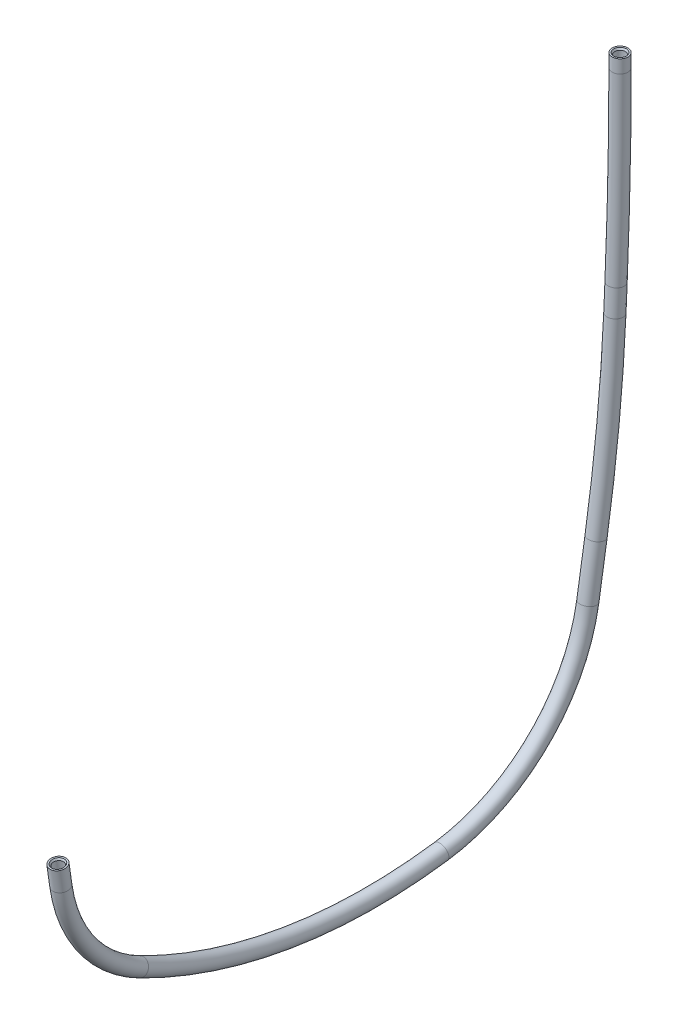
ISO-10303-21;
HEADER;
FILE_DESCRIPTION(('STEP AP214'),'2;1');
FILE_NAME('part.step','',(''),(''),'','','');
FILE_SCHEMA(('AUTOMOTIVE_DESIGN { 1 0 10303 214 1 1 1 1 }'));
ENDSEC;
DATA;
#1=APPLICATION_CONTEXT('core data for automotive mechanical design processes');
#2=APPLICATION_PROTOCOL_DEFINITION('international standard','automotive_design',2000,#1);
#3=PRODUCT_CONTEXT('',#1,'mechanical');
#4=PRODUCT('Part','Part','',(#3));
#5=PRODUCT_RELATED_PRODUCT_CATEGORY('part','',(#4));
#6=PRODUCT_DEFINITION_FORMATION('','',#4);
#7=PRODUCT_DEFINITION_CONTEXT('part definition',#1,'design');
#8=PRODUCT_DEFINITION('design','',#6,#7);
#9=PRODUCT_DEFINITION_SHAPE('','',#8);
#10=(LENGTH_UNIT() NAMED_UNIT(*) SI_UNIT(.MILLI.,.METRE.));
#11=(NAMED_UNIT(*) PLANE_ANGLE_UNIT() SI_UNIT($,.RADIAN.));
#12=(NAMED_UNIT(*) SI_UNIT($,.STERADIAN.) SOLID_ANGLE_UNIT());
#13=UNCERTAINTY_MEASURE_WITH_UNIT(LENGTH_MEASURE(1.E-05),#10,'distance_accuracy_value','');
#14=(GEOMETRIC_REPRESENTATION_CONTEXT(3) GLOBAL_UNCERTAINTY_ASSIGNED_CONTEXT((#13)) GLOBAL_UNIT_ASSIGNED_CONTEXT((#10,
#11,#12)) REPRESENTATION_CONTEXT('',''));
#15=CARTESIAN_POINT('',(0.,0.,0.));
#16=DIRECTION('',(0.,0.,1.));
#17=DIRECTION('',(1.,0.,0.));
#18=AXIS2_PLACEMENT_3D('',#15,#16,#17);
#19=CARTESIAN_POINT('',(177.721385977066,68.0000310706919,234.30397766195));
#20=DIRECTION('',(-0.00271511900951823,0.99026777444382,0.139148708319004));
#21=DIRECTION('',(0.,-0.13914922121502,0.990271424527262));
#22=AXIS2_PLACEMENT_3D('',#19,#20,#21);
#23=CYLINDRICAL_SURFACE('',#22,2.99999999999999);
#24=CARTESIAN_POINT('',(177.721385977066,68.0000310706919,234.30397766195));
#25=DIRECTION('',(0.00271511900951624,-0.990267774443821,-0.139148708319001));
#26=DIRECTION('',(-0.0181672512659778,-0.139175102673885,0.990101127045694));
#27=AXIS2_PLACEMENT_3D('',#24,#25,#26);
#28=CIRCLE('',#27,2.99999999999999);
#29=CARTESIAN_POINT('',(177.694742565726,67.5825282339697,237.274664705373));
#30=VERTEX_POINT('',#29);
#31=EDGE_CURVE('E56',#30,#30,#28,.T.);
#32=ORIENTED_EDGE('',*,*,#31,.F.);
#33=EDGE_LOOP('',(#32));
#34=FACE_BOUND('',#33,.T.);
#35=CARTESIAN_POINT('',(177.7,75.7999999999999,235.4));
#36=DIRECTION('',(0.00271511900951624,-0.990267774443821,-0.139148708319001));
#37=DIRECTION('',(-0.0181672512659778,-0.139175102673885,0.990101127045694));
#38=AXIS2_PLACEMENT_3D('',#35,#36,#37);
#39=CIRCLE('',#38,2.99999999999999);
#40=CARTESIAN_POINT('',(177.645498246202,75.3824746919783,238.370303381137));
#41=VERTEX_POINT('',#40);
#42=EDGE_CURVE('E53',#41,#41,#39,.T.);
#43=ORIENTED_EDGE('',*,*,#42,.T.);
#44=EDGE_LOOP('',(#43));
#45=FACE_BOUND('',#44,.T.);
#46=ADVANCED_FACE('F33',(#34,#45),#23,.T.);
#47=CARTESIAN_POINT('',(177.721385977066,68.0000310706919,234.30397766195));
#48=DIRECTION('',(-0.00271511900951823,0.99026777444382,0.139148708319004));
#49=DIRECTION('',(0.,-0.13914922121502,0.990271424527262));
#50=AXIS2_PLACEMENT_3D('',#47,#48,#49);
#51=CYLINDRICAL_SURFACE('',#50,2.);
#52=CARTESIAN_POINT('',(177.701881089629,75.1139223606262,235.303594946954));
#53=DIRECTION('',(0.00271511900951506,-0.990267774443823,-0.139148708318986));
#54=DIRECTION('',(0.,-0.139149221215002,0.990271424527265));
#55=AXIS2_PLACEMENT_3D('',#52,#53,#54);
#56=CIRCLE('',#55,2.);
#57=CARTESIAN_POINT('',(177.701881089629,74.8356239181962,237.284137796008));
#58=VERTEX_POINT('',#57);
#59=EDGE_CURVE('E48',#58,#58,#56,.T.);
#60=ORIENTED_EDGE('',*,*,#59,.F.);
#61=EDGE_LOOP('',(#60));
#62=FACE_BOUND('',#61,.T.);
#63=CARTESIAN_POINT('',(177.721385977066,68.0000310706919,234.30397766195));
#64=DIRECTION('',(0.00271511900951624,-0.990267774443821,-0.139148708319001));
#65=DIRECTION('',(-0.0181672512659778,-0.139175102673885,0.990101127045694));
#66=AXIS2_PLACEMENT_3D('',#63,#64,#65);
#67=CIRCLE('',#66,2.);
#68=CARTESIAN_POINT('',(177.703623702839,67.7216958462104,236.284435690899));
#69=VERTEX_POINT('',#68);
#70=EDGE_CURVE('E59',#69,#69,#67,.T.);
#71=ORIENTED_EDGE('',*,*,#70,.T.);
#72=EDGE_LOOP('',(#71));
#73=FACE_BOUND('',#72,.T.);
#74=ADVANCED_FACE('F126',(#62,#73),#51,.F.);
#75=CARTESIAN_POINT('',(178.209848518302,75.6542497439331,179.841381865862));
#76=DIRECTION('',(0.999956875836322,0.00145279086324259,0.00917256051330317));
#77=DIRECTION('',(-0.00917257019312752,0.,0.99995793109313));
#78=AXIS2_PLACEMENT_3D('',#75,#76,#77);
#79=TOROIDAL_SURFACE('',#78,55.0000000000003,2.99999999999999);
#80=CARTESIAN_POINT('',(178.054412898027,26.5259146309226,204.567532572993));
#81=DIRECTION('',(0.00884644641040738,-0.449572911912603,-0.893199830530846));
#82=DIRECTION('',(-0.0121124774577281,-0.893217428186312,0.44946180468875));
#83=AXIS2_PLACEMENT_3D('',#80,#81,#82);
#84=CIRCLE('',#83,2.99999999999999);
#85=CARTESIAN_POINT('',(178.045934591467,23.8461872611221,205.916231702473));
#86=VERTEX_POINT('',#85);
#87=EDGE_CURVE('E62',#86,#86,#84,.T.);
#88=CARTESIAN_POINT('',(178.209848518302,75.6542497439331,179.841381865862));
#89=DIRECTION('',(0.999956875836322,0.00145279086324259,0.00917256051330317));
#90=DIRECTION('',(-0.00917257019312752,0.,0.99995793109313));
#91=AXIS2_PLACEMENT_3D('',#88,#89,#90);
#92=CIRCLE('',#91,58.0000000000003);
#93=EDGE_CURVE('',#30,#86,#92,.T.);
#94=ORIENTED_EDGE('',*,*,#31,.T.);
#95=ORIENTED_EDGE('',*,*,#87,.F.);
#96=ORIENTED_EDGE('',*,*,#93,.T.);
#97=ORIENTED_EDGE('',*,*,#93,.F.);
#98=EDGE_LOOP('',(#94,#96,#95,#97));
#99=FACE_BOUND('',#98,.T.);
#100=ADVANCED_FACE('F132',(#99),#79,.T.);
#101=CARTESIAN_POINT('',(178.209848518302,75.6542497439331,179.841381865862));
#102=DIRECTION('',(0.999956875836322,0.00145279086324259,0.00917256051330317));
#103=DIRECTION('',(-0.00917257019312752,0.,0.99995793109313));
#104=AXIS2_PLACEMENT_3D('',#101,#102,#103);
#105=TOROIDAL_SURFACE('',#104,55.0000000000003,2.);
#106=CARTESIAN_POINT('',(178.054412898027,26.5259146309226,204.567532572993));
#107=DIRECTION('',(0.00884644641040738,-0.449572911912603,-0.893199830530846));
#108=DIRECTION('',(-0.0121124774577281,-0.893217428186312,0.44946180468875));
#109=AXIS2_PLACEMENT_3D('',#106,#107,#108);
#110=CIRCLE('',#109,2.);
#111=CARTESIAN_POINT('',(178.048760693654,24.7394297177223,205.466665325979));
#112=VERTEX_POINT('',#111);
#113=EDGE_CURVE('E65',#112,#112,#110,.T.);
#114=CARTESIAN_POINT('',(178.209848518302,75.6542497439331,179.841381865862));
#115=DIRECTION('',(0.999956875836322,0.00145279086324259,0.00917256051330317));
#116=DIRECTION('',(-0.00917257019312752,0.,0.99995793109313));
#117=AXIS2_PLACEMENT_3D('',#114,#115,#116);
#118=CIRCLE('',#117,57.0000000000003);
#119=EDGE_CURVE('',#69,#112,#118,.T.);
#120=ORIENTED_EDGE('',*,*,#70,.F.);
#121=ORIENTED_EDGE('',*,*,#113,.T.);
#122=ORIENTED_EDGE('',*,*,#119,.T.);
#123=ORIENTED_EDGE('',*,*,#119,.F.);
#124=EDGE_LOOP('',(#120,#122,#121,#123));
#125=FACE_BOUND('',#124,.T.);
#126=ADVANCED_FACE('F154',(#125),#105,.F.);
#127=CARTESIAN_POINT('',(178.590927179609,196.101288485671,119.220731373534));
#128=DIRECTION('',(0.999956875836322,0.00145279086324249,0.00917256051330334));
#129=DIRECTION('',(-0.0091725701931277,0.,0.99995793109313));
#130=AXIS2_PLACEMENT_3D('',#127,#128,#129);
#131=TOROIDAL_SURFACE('',#130,189.842491925627,2.99999999999999);
#132=CARTESIAN_POINT('',(179.121533589899,8.35191644400139,91.1126632199236));
#133=DIRECTION('',(0.00885632776274672,0.14807919318241,-0.988935851309379));
#134=DIRECTION('',(-0.00649163534613948,-0.988945282704618,-0.148138740668388));
#135=AXIS2_PLACEMENT_3D('',#132,#133,#134);
#136=CIRCLE('',#135,2.99999999999999);
#137=CARTESIAN_POINT('',(179.129918536887,5.38499312556082,90.6684833969266));
#138=VERTEX_POINT('',#137);
#139=EDGE_CURVE('E68',#138,#138,#136,.T.);
#140=CARTESIAN_POINT('',(178.590927179609,196.101288485671,119.220731373534));
#141=DIRECTION('',(0.999956875836322,0.00145279086324249,0.00917256051330334));
#142=DIRECTION('',(-0.0091725701931277,0.,0.99995793109313));
#143=AXIS2_PLACEMENT_3D('',#140,#141,#142);
#144=CIRCLE('',#143,192.842491925627);
#145=EDGE_CURVE('',#86,#138,#144,.T.);
#146=ORIENTED_EDGE('',*,*,#87,.T.);
#147=ORIENTED_EDGE('',*,*,#139,.F.);
#148=ORIENTED_EDGE('',*,*,#145,.T.);
#149=ORIENTED_EDGE('',*,*,#145,.F.);
#150=EDGE_LOOP('',(#146,#148,#147,#149));
#151=FACE_BOUND('',#150,.T.);
#152=ADVANCED_FACE('F156',(#151),#131,.T.);
#153=CARTESIAN_POINT('',(178.590927179609,196.101288485671,119.220731373534));
#154=DIRECTION('',(0.999956875836322,0.00145279086324249,0.00917256051330334));
#155=DIRECTION('',(-0.0091725701931277,0.,0.99995793109313));
#156=AXIS2_PLACEMENT_3D('',#153,#154,#155);
#157=TOROIDAL_SURFACE('',#156,189.842491925627,2.);
#158=CARTESIAN_POINT('',(179.121533589899,8.35191644400139,91.1126632199236));
#159=DIRECTION('',(0.00885632776274672,0.14807919318241,-0.988935851309379));
#160=DIRECTION('',(-0.00649163534613948,-0.988945282704618,-0.148138740668388));
#161=AXIS2_PLACEMENT_3D('',#158,#159,#160);
#162=CIRCLE('',#161,2.);
#163=CARTESIAN_POINT('',(179.127123554558,6.37396756504099,90.8165433379256));
#164=VERTEX_POINT('',#163);
#165=EDGE_CURVE('E71',#164,#164,#162,.T.);
#166=CARTESIAN_POINT('',(178.590927179609,196.101288485671,119.220731373534));
#167=DIRECTION('',(0.999956875836322,0.00145279086324249,0.00917256051330334));
#168=DIRECTION('',(-0.0091725701931277,0.,0.99995793109313));
#169=AXIS2_PLACEMENT_3D('',#166,#167,#168);
#170=CIRCLE('',#169,191.842491925627);
#171=EDGE_CURVE('',#112,#164,#170,.T.);
#172=ORIENTED_EDGE('',*,*,#113,.F.);
#173=ORIENTED_EDGE('',*,*,#165,.T.);
#174=ORIENTED_EDGE('',*,*,#171,.T.);
#175=ORIENTED_EDGE('',*,*,#171,.F.);
#176=EDGE_LOOP('',(#172,#174,#173,#175));
#177=FACE_BOUND('',#176,.T.);
#178=ADVANCED_FACE('F163',(#177),#157,.F.);
#179=CARTESIAN_POINT('',(178.937064756163,73.6242294496942,100.884619325857));
#180=DIRECTION('',(0.999956875836322,0.00145279086324259,0.00917256051330333));
#181=DIRECTION('',(-0.00917257019312769,0.,0.99995793109313));
#182=AXIS2_PLACEMENT_3D('',#179,#180,#181);
#183=TOROIDAL_SURFACE('',#182,66.0000000000003,2.99999999999999);
#184=CARTESIAN_POINT('',(179.55,63.3,35.6999999999997));
#185=DIRECTION('',(0.,0.987688340595136,-0.15643446504024));
#186=DIRECTION('',(0.,-0.15643446504024,-0.987688340595136));
#187=AXIS2_PLACEMENT_3D('',#184,#185,#186);
#188=CIRCLE('',#187,2.99999999999999);
#189=CARTESIAN_POINT('',(179.577860692902,62.8307168431957,32.7370627579153));
#190=VERTEX_POINT('',#189);
#191=EDGE_CURVE('E74',#190,#190,#188,.T.);
#192=CARTESIAN_POINT('',(178.937064756163,73.6242294496942,100.884619325857));
#193=DIRECTION('',(0.999956875836322,0.00145279086324259,0.00917256051330333));
#194=DIRECTION('',(-0.00917257019312769,0.,0.99995793109313));
#195=AXIS2_PLACEMENT_3D('',#192,#193,#194);
#196=CIRCLE('',#195,69.0000000000003);
#197=EDGE_CURVE('',#138,#190,#196,.T.);
#198=ORIENTED_EDGE('',*,*,#139,.T.);
#199=ORIENTED_EDGE('',*,*,#191,.F.);
#200=ORIENTED_EDGE('',*,*,#197,.T.);
#201=ORIENTED_EDGE('',*,*,#197,.F.);
#202=EDGE_LOOP('',(#198,#200,#199,#201));
#203=FACE_BOUND('',#202,.T.);
#204=ADVANCED_FACE('F170',(#203),#183,.T.);
#205=CARTESIAN_POINT('',(178.937064756163,73.6242294496942,100.884619325857));
#206=DIRECTION('',(0.999956875836322,0.00145279086324259,0.00917256051330333));
#207=DIRECTION('',(-0.00917257019312769,0.,0.99995793109313));
#208=AXIS2_PLACEMENT_3D('',#205,#206,#207);
#209=TOROIDAL_SURFACE('',#208,66.0000000000003,2.);
#210=CARTESIAN_POINT('',(179.55,63.3,35.6999999999997));
#211=DIRECTION('',(0.,0.987688340595136,-0.15643446504024));
#212=DIRECTION('',(0.,-0.15643446504024,-0.987688340595136));
#213=AXIS2_PLACEMENT_3D('',#210,#211,#212);
#214=CIRCLE('',#213,2.);
#215=CARTESIAN_POINT('',(179.568573795268,62.9871445621305,33.7247085052768));
#216=VERTEX_POINT('',#215);
#217=EDGE_CURVE('E77',#216,#216,#214,.T.);
#218=CARTESIAN_POINT('',(178.937064756163,73.6242294496942,100.884619325857));
#219=DIRECTION('',(0.999956875836322,0.00145279086324259,0.00917256051330333));
#220=DIRECTION('',(-0.00917257019312769,0.,0.99995793109313));
#221=AXIS2_PLACEMENT_3D('',#218,#219,#220);
#222=CIRCLE('',#221,68.0000000000003);
#223=EDGE_CURVE('',#164,#216,#222,.T.);
#224=ORIENTED_EDGE('',*,*,#165,.F.);
#225=ORIENTED_EDGE('',*,*,#217,.T.);
#226=ORIENTED_EDGE('',*,*,#223,.T.);
#227=ORIENTED_EDGE('',*,*,#223,.F.);
#228=EDGE_LOOP('',(#224,#226,#225,#227));
#229=FACE_BOUND('',#228,.T.);
#230=ADVANCED_FACE('F174',(#229),#209,.F.);
#231=CARTESIAN_POINT('',(179.55,83.0537668119028,32.5713106991951));
#232=DIRECTION('',(0.,-0.98768834059514,0.156434465040219));
#233=DIRECTION('',(0.,-0.156434465040219,-0.98768834059514));
#234=AXIS2_PLACEMENT_3D('',#231,#232,#233);
#235=CYLINDRICAL_SURFACE('',#234,2.99999999999999);
#236=CARTESIAN_POINT('',(179.55,83.0537668119028,32.5713106991951));
#237=DIRECTION('',(0.,0.987688340595136,-0.15643446504024));
#238=DIRECTION('',(0.,-0.15643446504024,-0.987688340595136));
#239=AXIS2_PLACEMENT_3D('',#236,#237,#238);
#240=CIRCLE('',#239,2.99999999999999);
#241=CARTESIAN_POINT('',(179.55,82.5844634167821,29.6082456774097));
#242=VERTEX_POINT('',#241);
#243=EDGE_CURVE('E80',#242,#242,#240,.T.);
#244=ORIENTED_EDGE('',*,*,#243,.F.);
#245=EDGE_LOOP('',(#244));
#246=FACE_BOUND('',#245,.T.);
#247=ORIENTED_EDGE('',*,*,#191,.T.);
#248=EDGE_LOOP('',(#247));
#249=FACE_BOUND('',#248,.T.);
#250=ADVANCED_FACE('F178',(#246,#249),#235,.T.);
#251=CARTESIAN_POINT('',(179.55,83.0537668119028,32.5713106991951));
#252=DIRECTION('',(0.,-0.98768834059514,0.156434465040219));
#253=DIRECTION('',(0.,-0.156434465040219,-0.98768834059514));
#254=AXIS2_PLACEMENT_3D('',#251,#252,#253);
#255=CYLINDRICAL_SURFACE('',#254,2.);
#256=CARTESIAN_POINT('',(179.55,83.0537668119028,32.5713106991951));
#257=DIRECTION('',(0.,0.987688340595136,-0.15643446504024));
#258=DIRECTION('',(0.,-0.15643446504024,-0.987688340595136));
#259=AXIS2_PLACEMENT_3D('',#256,#257,#258);
#260=CIRCLE('',#259,2.);
#261=CARTESIAN_POINT('',(179.55,82.7408978818223,30.5959340180049));
#262=VERTEX_POINT('',#261);
#263=EDGE_CURVE('E83',#262,#262,#260,.T.);
#264=ORIENTED_EDGE('',*,*,#263,.T.);
#265=EDGE_LOOP('',(#264));
#266=FACE_BOUND('',#265,.T.);
#267=ORIENTED_EDGE('',*,*,#217,.F.);
#268=EDGE_LOOP('',(#267));
#269=FACE_BOUND('',#268,.T.);
#270=ADVANCED_FACE('F182',(#266,#269),#255,.F.);
#271=CARTESIAN_POINT('',(179.55,182.617875995686,661.194355865558));
#272=DIRECTION('',(1.,0.,0.));
#273=DIRECTION('',(0.,0.,1.));
#274=AXIS2_PLACEMENT_3D('',#271,#272,#273);
#275=TOROIDAL_SURFACE('',#274,636.4589104976,2.99999999999999);
#276=CARTESIAN_POINT('',(179.55,153.115325108928,25.4195968172251));
#277=DIRECTION('',(0.,0.99892506580082,-0.0463542114033649));
#278=DIRECTION('',(0.,-0.0463542114033649,-0.99892506580082));
#279=AXIS2_PLACEMENT_3D('',#276,#277,#278);
#280=CIRCLE('',#279,2.99999999999999);
#281=CARTESIAN_POINT('',(179.55,152.976262474718,22.4228216198228));
#282=VERTEX_POINT('',#281);
#283=EDGE_CURVE('E86',#282,#282,#280,.T.);
#284=CARTESIAN_POINT('',(179.55,182.617875995686,661.194355865558));
#285=DIRECTION('',(1.,0.,0.));
#286=DIRECTION('',(0.,0.,1.));
#287=AXIS2_PLACEMENT_3D('',#284,#285,#286);
#288=CIRCLE('',#287,639.4589104976);
#289=EDGE_CURVE('',#242,#282,#288,.T.);
#290=ORIENTED_EDGE('',*,*,#243,.T.);
#291=ORIENTED_EDGE('',*,*,#283,.F.);
#292=ORIENTED_EDGE('',*,*,#289,.T.);
#293=ORIENTED_EDGE('',*,*,#289,.F.);
#294=EDGE_LOOP('',(#290,#292,#291,#293));
#295=FACE_BOUND('',#294,.T.);
#296=ADVANCED_FACE('F186',(#295),#275,.T.);
#297=CARTESIAN_POINT('',(179.55,182.617875995686,661.194355865558));
#298=DIRECTION('',(1.,0.,0.));
#299=DIRECTION('',(0.,0.,1.));
#300=AXIS2_PLACEMENT_3D('',#297,#298,#299);
#301=TOROIDAL_SURFACE('',#300,636.4589104976,2.);
#302=CARTESIAN_POINT('',(179.55,153.115325108928,25.4195968172251));
#303=DIRECTION('',(0.,0.99892506580082,-0.0463542114033649));
#304=DIRECTION('',(0.,-0.0463542114033649,-0.99892506580082));
#305=AXIS2_PLACEMENT_3D('',#302,#303,#304);
#306=CIRCLE('',#305,2.);
#307=CARTESIAN_POINT('',(179.55,153.022616686121,23.4217466856236));
#308=VERTEX_POINT('',#307);
#309=EDGE_CURVE('E89',#308,#308,#306,.T.);
#310=CARTESIAN_POINT('',(179.55,182.617875995686,661.194355865558));
#311=DIRECTION('',(1.,0.,0.));
#312=DIRECTION('',(0.,0.,1.));
#313=AXIS2_PLACEMENT_3D('',#310,#311,#312);
#314=CIRCLE('',#313,638.4589104976);
#315=EDGE_CURVE('',#262,#308,#314,.T.);
#316=ORIENTED_EDGE('',*,*,#263,.F.);
#317=ORIENTED_EDGE('',*,*,#309,.T.);
#318=ORIENTED_EDGE('',*,*,#315,.T.);
#319=ORIENTED_EDGE('',*,*,#315,.F.);
#320=EDGE_LOOP('',(#316,#318,#317,#319));
#321=FACE_BOUND('',#320,.T.);
#322=ADVANCED_FACE('F190',(#321),#301,.F.);
#323=CARTESIAN_POINT('',(179.55,317.622834775353,3570.52736465928));
#324=DIRECTION('',(1.,0.,0.));
#325=DIRECTION('',(0.,0.,1.));
#326=AXIS2_PLACEMENT_3D('',#323,#324,#325);
#327=TOROIDAL_SURFACE('',#326,3548.92262614314,2.99999999999999);
#328=CARTESIAN_POINT('',(179.55,163.105218927325,24.9701288015134));
#329=DIRECTION('',(0.,0.999051714945662,-0.043539302522341));
#330=DIRECTION('',(0.,-0.043539302522341,-0.999051714945662));
#331=AXIS2_PLACEMENT_3D('',#328,#329,#330);
#332=CIRCLE('',#331,2.99999999999999);
#333=CARTESIAN_POINT('',(179.55,162.974601019758,21.9729736566765));
#334=VERTEX_POINT('',#333);
#335=EDGE_CURVE('E92',#334,#334,#332,.T.);
#336=CARTESIAN_POINT('',(179.55,317.622834775353,3570.52736465928));
#337=DIRECTION('',(1.,0.,0.));
#338=DIRECTION('',(0.,0.,1.));
#339=AXIS2_PLACEMENT_3D('',#336,#337,#338);
#340=CIRCLE('',#339,3551.92262614314);
#341=EDGE_CURVE('',#282,#334,#340,.T.);
#342=ORIENTED_EDGE('',*,*,#283,.T.);
#343=ORIENTED_EDGE('',*,*,#335,.F.);
#344=ORIENTED_EDGE('',*,*,#341,.T.);
#345=ORIENTED_EDGE('',*,*,#341,.F.);
#346=EDGE_LOOP('',(#342,#344,#343,#345));
#347=FACE_BOUND('',#346,.T.);
#348=ADVANCED_FACE('F194',(#347),#327,.T.);
#349=CARTESIAN_POINT('',(179.55,317.622834775353,3570.52736465928));
#350=DIRECTION('',(1.,0.,0.));
#351=DIRECTION('',(0.,0.,1.));
#352=AXIS2_PLACEMENT_3D('',#349,#350,#351);
#353=TOROIDAL_SURFACE('',#352,3548.92262614314,2.);
#354=CARTESIAN_POINT('',(179.55,163.105218927325,24.9701288015134));
#355=DIRECTION('',(0.,0.999051714945662,-0.043539302522341));
#356=DIRECTION('',(0.,-0.043539302522341,-0.999051714945662));
#357=AXIS2_PLACEMENT_3D('',#354,#355,#356);
#358=CIRCLE('',#357,2.);
#359=CARTESIAN_POINT('',(179.55,163.01814032228,22.9720253716224));
#360=VERTEX_POINT('',#359);
#361=EDGE_CURVE('E95',#360,#360,#358,.T.);
#362=CARTESIAN_POINT('',(179.55,317.622834775353,3570.52736465928));
#363=DIRECTION('',(1.,0.,0.));
#364=DIRECTION('',(0.,0.,1.));
#365=AXIS2_PLACEMENT_3D('',#362,#363,#364);
#366=CIRCLE('',#365,3550.92262614314);
#367=EDGE_CURVE('',#308,#360,#366,.T.);
#368=ORIENTED_EDGE('',*,*,#309,.F.);
#369=ORIENTED_EDGE('',*,*,#361,.T.);
#370=ORIENTED_EDGE('',*,*,#367,.T.);
#371=ORIENTED_EDGE('',*,*,#367,.F.);
#372=EDGE_LOOP('',(#368,#370,#369,#371));
#373=FACE_BOUND('',#372,.T.);
#374=ADVANCED_FACE('F198',(#373),#353,.F.);
#375=CARTESIAN_POINT('',(179.55,232.9,1626.47937872883));
#376=DIRECTION('',(1.,0.,0.));
#377=DIRECTION('',(0.,0.,1.));
#378=AXIS2_PLACEMENT_3D('',#375,#376,#377);
#379=TOROIDAL_SURFACE('',#378,1603.02937872883,2.99999999999999);
#380=CARTESIAN_POINT('',(179.55,232.9,23.45));
#381=DIRECTION('',(0.,1.,0.));
#382=DIRECTION('',(0.,0.,-1.));
#383=AXIS2_PLACEMENT_3D('',#380,#381,#382);
#384=CIRCLE('',#383,2.99999999999999);
#385=CARTESIAN_POINT('',(179.55,232.9,20.4500000000003));
#386=VERTEX_POINT('',#385);
#387=EDGE_CURVE('E98',#386,#386,#384,.T.);
#388=CARTESIAN_POINT('',(179.55,232.9,1626.47937872883));
#389=DIRECTION('',(1.,0.,0.));
#390=DIRECTION('',(0.,0.,1.));
#391=AXIS2_PLACEMENT_3D('',#388,#389,#390);
#392=CIRCLE('',#391,1606.02937872883);
#393=EDGE_CURVE('',#334,#386,#392,.T.);
#394=ORIENTED_EDGE('',*,*,#335,.T.);
#395=ORIENTED_EDGE('',*,*,#387,.F.);
#396=ORIENTED_EDGE('',*,*,#393,.T.);
#397=ORIENTED_EDGE('',*,*,#393,.F.);
#398=EDGE_LOOP('',(#394,#396,#395,#397));
#399=FACE_BOUND('',#398,.T.);
#400=ADVANCED_FACE('F123',(#399),#379,.T.);
#401=CARTESIAN_POINT('',(179.55,232.9,1626.47937872883));
#402=DIRECTION('',(1.,0.,0.));
#403=DIRECTION('',(0.,0.,1.));
#404=AXIS2_PLACEMENT_3D('',#401,#402,#403);
#405=TOROIDAL_SURFACE('',#404,1603.02937872883,2.);
#406=CARTESIAN_POINT('',(179.55,232.9,23.45));
#407=DIRECTION('',(0.,1.,0.));
#408=DIRECTION('',(0.,0.,-1.));
#409=AXIS2_PLACEMENT_3D('',#406,#407,#408);
#410=CIRCLE('',#409,2.);
#411=CARTESIAN_POINT('',(179.55,232.9,21.4500000000002));
#412=VERTEX_POINT('',#411);
#413=EDGE_CURVE('E102',#412,#412,#410,.T.);
#414=CARTESIAN_POINT('',(179.55,232.9,1626.47937872883));
#415=DIRECTION('',(1.,0.,0.));
#416=DIRECTION('',(0.,0.,1.));
#417=AXIS2_PLACEMENT_3D('',#414,#415,#416);
#418=CIRCLE('',#417,1605.02937872883);
#419=EDGE_CURVE('',#360,#412,#418,.T.);
#420=ORIENTED_EDGE('',*,*,#361,.F.);
#421=ORIENTED_EDGE('',*,*,#413,.T.);
#422=ORIENTED_EDGE('',*,*,#419,.T.);
#423=ORIENTED_EDGE('',*,*,#419,.F.);
#424=EDGE_LOOP('',(#420,#422,#421,#423));
#425=FACE_BOUND('',#424,.T.);
#426=ADVANCED_FACE('F108',(#425),#405,.F.);
#427=CARTESIAN_POINT('',(179.55,232.9,23.45));
#428=DIRECTION('',(0.,1.,0.));
#429=DIRECTION('',(0.,0.,1.));
#430=AXIS2_PLACEMENT_3D('',#427,#428,#429);
#431=CYLINDRICAL_SURFACE('',#430,2.);
#432=CARTESIAN_POINT('',(179.55,237.207179676972,23.45));
#433=DIRECTION('',(0.,1.,0.));
#434=DIRECTION('',(0.,0.,-1.));
#435=AXIS2_PLACEMENT_3D('',#432,#433,#434);
#436=CIRCLE('',#435,2.);
#437=CARTESIAN_POINT('',(179.55,237.207179676972,25.45));
#438=VERTEX_POINT('',#437);
#439=EDGE_CURVE('E10',#438,#438,#436,.F.);
#440=ORIENTED_EDGE('',*,*,#439,.F.);
#441=EDGE_LOOP('',(#440));
#442=FACE_BOUND('',#441,.T.);
#443=ORIENTED_EDGE('',*,*,#413,.F.);
#444=EDGE_LOOP('',(#443));
#445=FACE_BOUND('',#444,.T.);
#446=ADVANCED_FACE('F111',(#442,#445),#431,.F.);
#447=CARTESIAN_POINT('',(179.55,232.9,23.45));
#448=DIRECTION('',(0.,1.,0.));
#449=DIRECTION('',(0.,0.,1.));
#450=AXIS2_PLACEMENT_3D('',#447,#448,#449);
#451=CYLINDRICAL_SURFACE('',#450,2.99999999999999);
#452=ORIENTED_EDGE('',*,*,#387,.T.);
#453=EDGE_LOOP('',(#452));
#454=FACE_BOUND('',#453,.T.);
#455=CARTESIAN_POINT('',(179.55,237.9,23.45));
#456=DIRECTION('',(0.,1.,0.));
#457=DIRECTION('',(0.,0.,-1.));
#458=AXIS2_PLACEMENT_3D('',#455,#456,#457);
#459=CIRCLE('',#458,2.99999999999999);
#460=CARTESIAN_POINT('',(179.55,237.9,20.45));
#461=VERTEX_POINT('',#460);
#462=EDGE_CURVE('E99',#461,#461,#459,.T.);
#463=ORIENTED_EDGE('',*,*,#462,.F.);
#464=EDGE_LOOP('',(#463));
#465=FACE_BOUND('',#464,.T.);
#466=ADVANCED_FACE('F113',(#454,#465),#451,.T.);
#467=CARTESIAN_POINT('',(177.7,75.7999999999999,235.4));
#468=DIRECTION('',(-0.00271511900951624,0.990267774443821,0.139148708319001));
#469=DIRECTION('',(-0.0181672512659778,-0.139175102673885,0.990101127045694));
#470=AXIS2_PLACEMENT_3D('',#467,#468,#469);
#471=PLANE('',#470);
#472=CARTESIAN_POINT('',(177.7,75.7999999999999,235.4));
#473=DIRECTION('',(0.00271511900951624,-0.990267774443821,-0.139148708319001));
#474=DIRECTION('',(0.,-0.139149221215017,0.990271424527263));
#475=AXIS2_PLACEMENT_3D('',#472,#473,#474);
#476=CIRCLE('',#475,2.39999999999985);
#477=CARTESIAN_POINT('',(177.7,75.4660418690839,237.776651418866));
#478=VERTEX_POINT('',#477);
#479=EDGE_CURVE('E44',#478,#478,#476,.F.);
#480=ORIENTED_EDGE('',*,*,#479,.F.);
#481=EDGE_LOOP('',(#480));
#482=FACE_BOUND('',#481,.T.);
#483=ORIENTED_EDGE('',*,*,#42,.F.);
#484=EDGE_LOOP('',(#483));
#485=FACE_BOUND('',#484,.T.);
#486=ADVANCED_FACE('F120',(#482,#485),#471,.T.);
#487=CARTESIAN_POINT('',(179.55,237.9,23.45));
#488=DIRECTION('',(0.,-1.,0.));
#489=DIRECTION('',(0.,0.,-1.));
#490=AXIS2_PLACEMENT_3D('',#487,#488,#489);
#491=PLANE('',#490);
#492=CARTESIAN_POINT('',(179.55,237.9,23.45));
#493=DIRECTION('',(0.,1.,0.));
#494=DIRECTION('',(0.,0.,-1.));
#495=AXIS2_PLACEMENT_3D('',#492,#493,#494);
#496=CIRCLE('',#495,2.40000000000007);
#497=CARTESIAN_POINT('',(179.55,237.9,25.8500000000001));
#498=VERTEX_POINT('',#497);
#499=EDGE_CURVE('E40',#498,#498,#496,.T.);
#500=ORIENTED_EDGE('',*,*,#499,.F.);
#501=EDGE_LOOP('',(#500));
#502=FACE_BOUND('',#501,.T.);
#503=ORIENTED_EDGE('',*,*,#462,.T.);
#504=EDGE_LOOP('',(#503));
#505=FACE_BOUND('',#504,.T.);
#506=ADVANCED_FACE('F140',(#502,#505),#491,.F.);
#507=CARTESIAN_POINT('',(177.701881089629,75.1139223606262,235.303594946954));
#508=DIRECTION('',(-0.00271511900951506,0.990267774443823,0.139148708318986));
#509=DIRECTION('',(0.,-0.139149221215002,0.990271424527265));
#510=AXIS2_PLACEMENT_3D('',#507,#508,#509);
#511=CONICAL_SURFACE('',#510,2.,0.523598775598321);
#512=ORIENTED_EDGE('',*,*,#479,.T.);
#513=EDGE_LOOP('',(#512));
#514=FACE_BOUND('',#513,.T.);
#515=ORIENTED_EDGE('',*,*,#59,.T.);
#516=EDGE_LOOP('',(#515));
#517=FACE_BOUND('',#516,.T.);
#518=ADVANCED_FACE('F138',(#514,#517),#511,.F.);
#519=CARTESIAN_POINT('',(179.55,237.9,23.45));
#520=DIRECTION('',(0.,1.,0.));
#521=DIRECTION('',(0.,0.,1.));
#522=AXIS2_PLACEMENT_3D('',#519,#520,#521);
#523=CONICAL_SURFACE('',#522,2.40000000000006,0.523598775598291);
#524=CARTESIAN_POINT('',(179.55,237.207179676972,25.45));
#525=CARTESIAN_POINT('',(179.55,237.214396555337,25.4541666666667));
#526=CARTESIAN_POINT('',(179.55,237.221613433702,25.4583333333333));
#527=CARTESIAN_POINT('',(179.55,237.236047190432,25.4666666666667));
#528=CARTESIAN_POINT('',(179.55,237.243264068797,25.4708333333333));
#529=CARTESIAN_POINT('',(179.55,237.257697825526,25.4791666666667));
#530=CARTESIAN_POINT('',(179.55,237.264914703891,25.4833333333333));
#531=CARTESIAN_POINT('',(179.55,237.279348460621,25.4916666666667));
#532=CARTESIAN_POINT('',(179.55,237.286565338986,25.4958333333333));
#533=CARTESIAN_POINT('',(179.55,237.300999095716,25.5041666666667));
#534=CARTESIAN_POINT('',(179.55,237.308215974081,25.5083333333333));
#535=CARTESIAN_POINT('',(179.55,237.32264973081,25.5166666666667));
#536=CARTESIAN_POINT('',(179.55,237.329866609175,25.5208333333333));
#537=CARTESIAN_POINT('',(179.55,237.344300365905,25.5291666666667));
#538=CARTESIAN_POINT('',(179.55,237.35151724427,25.5333333333333));
#539=CARTESIAN_POINT('',(179.55,237.365951001,25.5416666666667));
#540=CARTESIAN_POINT('',(179.55,237.373167879364,25.5458333333334));
#541=CARTESIAN_POINT('',(179.55,237.387601636094,25.5541666666667));
#542=CARTESIAN_POINT('',(179.55,237.394818514459,25.5583333333334));
#543=CARTESIAN_POINT('',(179.55,237.409252271189,25.5666666666667));
#544=CARTESIAN_POINT('',(179.55,237.416469149554,25.5708333333334));
#545=CARTESIAN_POINT('',(179.55,237.430902906283,25.5791666666667));
#546=CARTESIAN_POINT('',(179.55,237.438119784648,25.5833333333334));
#547=CARTESIAN_POINT('',(179.55,237.452553541378,25.5916666666667));
#548=CARTESIAN_POINT('',(179.55,237.459770419743,25.5958333333334));
#549=CARTESIAN_POINT('',(179.55,237.474204176473,25.6041666666667));
#550=CARTESIAN_POINT('',(179.55,237.481421054837,25.6083333333334));
#551=CARTESIAN_POINT('',(179.55,237.495854811567,25.6166666666667));
#552=CARTESIAN_POINT('',(179.55,237.503071689932,25.6208333333334));
#553=CARTESIAN_POINT('',(179.55,237.517505446662,25.6291666666667));
#554=CARTESIAN_POINT('',(179.55,237.524722325027,25.6333333333334));
#555=CARTESIAN_POINT('',(179.55,237.539156081756,25.6416666666667));
#556=CARTESIAN_POINT('',(179.55,237.546372960121,25.6458333333334));
#557=CARTESIAN_POINT('',(179.55,237.560806716851,25.6541666666667));
#558=CARTESIAN_POINT('',(179.55,237.568023595216,25.6583333333334));
#559=CARTESIAN_POINT('',(179.55,237.582457351946,25.6666666666667));
#560=CARTESIAN_POINT('',(179.55,237.589674230311,25.6708333333334));
#561=CARTESIAN_POINT('',(179.55,237.60410798704,25.6791666666667));
#562=CARTESIAN_POINT('',(179.55,237.611324865405,25.6833333333334));
#563=CARTESIAN_POINT('',(179.55,237.625758622135,25.6916666666667));
#564=CARTESIAN_POINT('',(179.55,237.6329755005,25.6958333333334));
#565=CARTESIAN_POINT('',(179.55,237.647409257229,25.7041666666667));
#566=CARTESIAN_POINT('',(179.55,237.654626135594,25.7083333333334));
#567=CARTESIAN_POINT('',(179.55,237.669059892324,25.7166666666667));
#568=CARTESIAN_POINT('',(179.55,237.676276770689,25.7208333333334));
#569=CARTESIAN_POINT('',(179.55,237.690710527419,25.7291666666667));
#570=CARTESIAN_POINT('',(179.55,237.697927405784,25.7333333333334));
#571=CARTESIAN_POINT('',(179.55,237.712361162513,25.7416666666667));
#572=CARTESIAN_POINT('',(179.55,237.719578040878,25.7458333333334));
#573=CARTESIAN_POINT('',(179.55,237.734011797608,25.7541666666667));
#574=CARTESIAN_POINT('',(179.55,237.741228675973,25.7583333333334));
#575=CARTESIAN_POINT('',(179.55,237.755662432703,25.7666666666667));
#576=CARTESIAN_POINT('',(179.55,237.762879311067,25.7708333333334));
#577=CARTESIAN_POINT('',(179.55,237.777313067797,25.7791666666667));
#578=CARTESIAN_POINT('',(179.55,237.784529946162,25.7833333333334));
#579=CARTESIAN_POINT('',(179.55,237.798963702892,25.7916666666667));
#580=CARTESIAN_POINT('',(179.55,237.806180581257,25.7958333333334));
#581=CARTESIAN_POINT('',(179.55,237.820614337986,25.8041666666667));
#582=CARTESIAN_POINT('',(179.55,237.827831216351,25.8083333333334));
#583=CARTESIAN_POINT('',(179.55,237.842264973081,25.8166666666667));
#584=CARTESIAN_POINT('',(179.55,237.849481851446,25.8208333333334));
#585=CARTESIAN_POINT('',(179.55,237.863915608176,25.8291666666667));
#586=CARTESIAN_POINT('',(179.55,237.871132486541,25.8333333333334));
#587=CARTESIAN_POINT('',(179.55,237.88556624327,25.8416666666667));
#588=CARTESIAN_POINT('',(179.55,237.892783121635,25.8458333333334));
#589=CARTESIAN_POINT('',(179.55,237.9,25.8500000000001));
#590=B_SPLINE_CURVE_WITH_KNOTS('',3,(#524,#525,#526,#527,#528,#529,#530,#531,#532,#533,#534,
#535,#536,#537,#538,#539,#540,#541,#542,#543,#544,#545,#546,#547,#548,#549,#550,#551,#552,#553,
#554,#555,#556,#557,#558,#559,#560,#561,#562,#563,#564,#565,#566,#567,#568,#569,#570,#571,#572,
#573,#574,#575,#576,#577,#578,#579,#580,#581,#582,#583,#584,#585,#586,#587,#588,#589),
.UNSPECIFIED.,.F.,.F.,(4,2,2,2,2,2,2,2,2,2,2,2,2,2,2,2,2,2,2,2,2,2,2,2,2,2,2,2,2,2,2,2,4),(0.,
0.0250000000000156,0.0500000000000053,0.0750000000000209,0.100000000000012,0.125000000000028,
0.15000000000002,0.175000000000033,0.200000000000025,0.22500000000004,0.250000000000032,
0.275000000000048,0.300000000000037,0.325000000000053,0.350000000000044,0.37500000000006,
0.400000000000051,0.425000000000064,0.450000000000055,0.475000000000071,0.500000000000062,
0.525000000000078,0.550000000000069,0.575000000000083,0.600000000000099,0.62500000000009,
0.650000000000106,0.675000000000097,0.700000000000113,0.725000000000103,0.750000000000118,
0.77500000000011,0.800000000000125),.UNSPECIFIED.);
#591=EDGE_CURVE('BSEAM35',#438,#498,#590,.T.);
#592=ORIENTED_EDGE('',*,*,#439,.T.);
#593=ORIENTED_EDGE('',*,*,#499,.T.);
#594=ORIENTED_EDGE('',*,*,#591,.T.);
#595=ORIENTED_EDGE('',*,*,#591,.F.);
#596=EDGE_LOOP('',(#592,#594,#593,#595));
#597=FACE_BOUND('',#596,.T.);
#598=ADVANCED_FACE('F35',(#597),#523,.F.);
#599=CLOSED_SHELL('',(#46,#74,#100,#126,#152,#178,#204,#230,#250,#270,#296,#322,#348,#374,#400,
#426,#446,#466,#486,#506,#518,#598));
#600=MANIFOLD_SOLID_BREP('B2',#599);
#601=ADVANCED_BREP_SHAPE_REPRESENTATION('',(#18,#600),#14);
#602=SHAPE_DEFINITION_REPRESENTATION(#9,#601);
ENDSEC;
END-ISO-10303-21;
